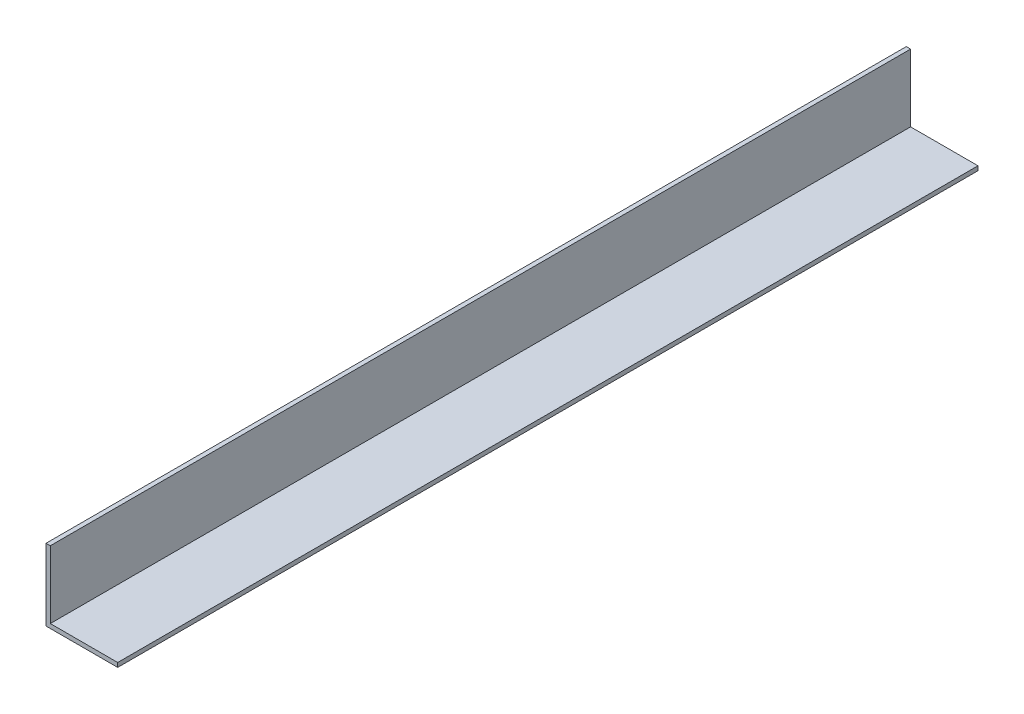
ISO-10303-21;
HEADER;
FILE_DESCRIPTION(('STEP AP214'),'2;1');
FILE_NAME('part.step','',(''),(''),'','','');
FILE_SCHEMA(('AUTOMOTIVE_DESIGN { 1 0 10303 214 1 1 1 1 }'));
ENDSEC;
DATA;
#1=APPLICATION_CONTEXT('core data for automotive mechanical design processes');
#2=APPLICATION_PROTOCOL_DEFINITION('international standard','automotive_design',2000,#1);
#3=PRODUCT_CONTEXT('',#1,'mechanical');
#4=PRODUCT('Part','Part','',(#3));
#5=PRODUCT_RELATED_PRODUCT_CATEGORY('part','',(#4));
#6=PRODUCT_DEFINITION_FORMATION('','',#4);
#7=PRODUCT_DEFINITION_CONTEXT('part definition',#1,'design');
#8=PRODUCT_DEFINITION('design','',#6,#7);
#9=PRODUCT_DEFINITION_SHAPE('','',#8);
#10=(LENGTH_UNIT() NAMED_UNIT(*) SI_UNIT(.MILLI.,.METRE.));
#11=(NAMED_UNIT(*) PLANE_ANGLE_UNIT() SI_UNIT($,.RADIAN.));
#12=(NAMED_UNIT(*) SI_UNIT($,.STERADIAN.) SOLID_ANGLE_UNIT());
#13=UNCERTAINTY_MEASURE_WITH_UNIT(LENGTH_MEASURE(1.E-05),#10,'distance_accuracy_value','');
#14=(GEOMETRIC_REPRESENTATION_CONTEXT(3) GLOBAL_UNCERTAINTY_ASSIGNED_CONTEXT((#13)) GLOBAL_UNIT_ASSIGNED_CONTEXT((#10,
#11,#12)) REPRESENTATION_CONTEXT('',''));
#15=CARTESIAN_POINT('',(0.,0.,0.));
#16=DIRECTION('',(0.,0.,1.));
#17=DIRECTION('',(1.,0.,0.));
#18=AXIS2_PLACEMENT_3D('',#15,#16,#17);
#19=CARTESIAN_POINT('',(25.,0.,300.));
#20=DIRECTION('',(0.,1.,0.));
#21=DIRECTION('',(-1.,0.,0.));
#22=AXIS2_PLACEMENT_3D('',#19,#20,#21);
#23=PLANE('',#22);
#24=DIRECTION('',(1.,0.,0.));
#25=VECTOR('',#24,1.);
#26=CARTESIAN_POINT('',(25.,0.,0.));
#27=LINE('',#26,#25);
#28=CARTESIAN_POINT('',(0.,0.,0.));
#29=VERTEX_POINT('',#28);
#30=CARTESIAN_POINT('',(25.,0.,0.));
#31=VERTEX_POINT('',#30);
#32=EDGE_CURVE('E116',#29,#31,#27,.T.);
#33=ORIENTED_EDGE('',*,*,#32,.T.);
#34=DIRECTION('',(0.,0.,-1.));
#35=VECTOR('',#34,1.);
#36=CARTESIAN_POINT('',(25.,0.,300.));
#37=LINE('',#36,#35);
#38=CARTESIAN_POINT('',(25.,0.,300.));
#39=VERTEX_POINT('',#38);
#40=EDGE_CURVE('E11',#39,#31,#37,.T.);
#41=ORIENTED_EDGE('',*,*,#40,.F.);
#42=DIRECTION('',(1.,0.,0.));
#43=VECTOR('',#42,1.);
#44=CARTESIAN_POINT('',(25.,0.,300.));
#45=LINE('',#44,#43);
#46=CARTESIAN_POINT('',(0.,0.,300.));
#47=VERTEX_POINT('',#46);
#48=EDGE_CURVE('E126',#47,#39,#45,.T.);
#49=ORIENTED_EDGE('',*,*,#48,.F.);
#50=DIRECTION('',(0.,0.,-1.));
#51=VECTOR('',#50,1.);
#52=CARTESIAN_POINT('',(0.,0.,300.));
#53=LINE('',#52,#51);
#54=EDGE_CURVE('E112',#47,#29,#53,.T.);
#55=ORIENTED_EDGE('',*,*,#54,.T.);
#56=EDGE_LOOP('',(#33,#41,#49,#55));
#57=FACE_BOUND('',#56,.T.);
#58=ADVANCED_FACE('F32',(#57),#23,.F.);
#59=CARTESIAN_POINT('',(25.,1.5,300.));
#60=DIRECTION('',(-1.,0.,0.));
#61=DIRECTION('',(0.,0.,1.));
#62=AXIS2_PLACEMENT_3D('',#59,#60,#61);
#63=PLANE('',#62);
#64=DIRECTION('',(0.,1.,0.));
#65=VECTOR('',#64,1.);
#66=CARTESIAN_POINT('',(25.,1.5,0.));
#67=LINE('',#66,#65);
#68=CARTESIAN_POINT('',(25.,1.5,0.));
#69=VERTEX_POINT('',#68);
#70=EDGE_CURVE('E119',#31,#69,#67,.T.);
#71=ORIENTED_EDGE('',*,*,#70,.T.);
#72=DIRECTION('',(0.,0.,-1.));
#73=VECTOR('',#72,1.);
#74=CARTESIAN_POINT('',(25.,1.5,300.));
#75=LINE('',#74,#73);
#76=CARTESIAN_POINT('',(25.,1.5,300.));
#77=VERTEX_POINT('',#76);
#78=EDGE_CURVE('E40',#77,#69,#75,.T.);
#79=ORIENTED_EDGE('',*,*,#78,.F.);
#80=DIRECTION('',(0.,1.,0.));
#81=VECTOR('',#80,1.);
#82=CARTESIAN_POINT('',(25.,1.5,300.));
#83=LINE('',#82,#81);
#84=EDGE_CURVE('E85',#39,#77,#83,.T.);
#85=ORIENTED_EDGE('',*,*,#84,.F.);
#86=ORIENTED_EDGE('',*,*,#40,.T.);
#87=EDGE_LOOP('',(#71,#79,#85,#86));
#88=FACE_BOUND('',#87,.T.);
#89=ADVANCED_FACE('F150',(#88),#63,.F.);
#90=CARTESIAN_POINT('',(1.5,1.5,300.));
#91=DIRECTION('',(0.,-1.,0.));
#92=DIRECTION('',(1.,0.,0.));
#93=AXIS2_PLACEMENT_3D('',#90,#91,#92);
#94=PLANE('',#93);
#95=DIRECTION('',(-1.,0.,0.));
#96=VECTOR('',#95,1.);
#97=CARTESIAN_POINT('',(1.5,1.5,0.));
#98=LINE('',#97,#96);
#99=CARTESIAN_POINT('',(1.5,1.5,0.));
#100=VERTEX_POINT('',#99);
#101=EDGE_CURVE('E121',#69,#100,#98,.T.);
#102=ORIENTED_EDGE('',*,*,#101,.T.);
#103=DIRECTION('',(0.,0.,-1.));
#104=VECTOR('',#103,1.);
#105=CARTESIAN_POINT('',(1.5,1.5,300.));
#106=LINE('',#105,#104);
#107=CARTESIAN_POINT('',(1.5,1.5,300.));
#108=VERTEX_POINT('',#107);
#109=EDGE_CURVE('E107',#108,#100,#106,.T.);
#110=ORIENTED_EDGE('',*,*,#109,.F.);
#111=DIRECTION('',(-1.,0.,0.));
#112=VECTOR('',#111,1.);
#113=CARTESIAN_POINT('',(1.5,1.5,300.));
#114=LINE('',#113,#112);
#115=EDGE_CURVE('E98',#77,#108,#114,.T.);
#116=ORIENTED_EDGE('',*,*,#115,.F.);
#117=ORIENTED_EDGE('',*,*,#78,.T.);
#118=EDGE_LOOP('',(#102,#110,#116,#117));
#119=FACE_BOUND('',#118,.T.);
#120=ADVANCED_FACE('F132',(#119),#94,.F.);
#121=CARTESIAN_POINT('',(1.5,25.,300.));
#122=DIRECTION('',(-1.,0.,0.));
#123=DIRECTION('',(0.,-1.,0.));
#124=AXIS2_PLACEMENT_3D('',#121,#122,#123);
#125=PLANE('',#124);
#126=DIRECTION('',(0.,1.,0.));
#127=VECTOR('',#126,1.);
#128=CARTESIAN_POINT('',(1.5,25.,0.));
#129=LINE('',#128,#127);
#130=CARTESIAN_POINT('',(1.5,25.,0.));
#131=VERTEX_POINT('',#130);
#132=EDGE_CURVE('E106',#100,#131,#129,.T.);
#133=ORIENTED_EDGE('',*,*,#132,.T.);
#134=DIRECTION('',(0.,0.,-1.));
#135=VECTOR('',#134,1.);
#136=CARTESIAN_POINT('',(1.5,25.,300.));
#137=LINE('',#136,#135);
#138=CARTESIAN_POINT('',(1.5,25.,300.));
#139=VERTEX_POINT('',#138);
#140=EDGE_CURVE('E103',#139,#131,#137,.T.);
#141=ORIENTED_EDGE('',*,*,#140,.F.);
#142=DIRECTION('',(0.,1.,0.));
#143=VECTOR('',#142,1.);
#144=CARTESIAN_POINT('',(1.5,25.,300.));
#145=LINE('',#144,#143);
#146=EDGE_CURVE('E92',#108,#139,#145,.T.);
#147=ORIENTED_EDGE('',*,*,#146,.F.);
#148=ORIENTED_EDGE('',*,*,#109,.T.);
#149=EDGE_LOOP('',(#133,#141,#147,#148));
#150=FACE_BOUND('',#149,.T.);
#151=ADVANCED_FACE('F104',(#150),#125,.F.);
#152=CARTESIAN_POINT('',(0.,25.,300.));
#153=DIRECTION('',(0.,-1.,0.));
#154=DIRECTION('',(0.,0.,-1.));
#155=AXIS2_PLACEMENT_3D('',#152,#153,#154);
#156=PLANE('',#155);
#157=DIRECTION('',(-1.,0.,0.));
#158=VECTOR('',#157,1.);
#159=CARTESIAN_POINT('',(0.,25.,0.));
#160=LINE('',#159,#158);
#161=CARTESIAN_POINT('',(0.,25.,0.));
#162=VERTEX_POINT('',#161);
#163=EDGE_CURVE('E71',#131,#162,#160,.T.);
#164=ORIENTED_EDGE('',*,*,#163,.T.);
#165=DIRECTION('',(0.,0.,-1.));
#166=VECTOR('',#165,1.);
#167=CARTESIAN_POINT('',(0.,25.,300.));
#168=LINE('',#167,#166);
#169=CARTESIAN_POINT('',(0.,25.,300.));
#170=VERTEX_POINT('',#169);
#171=EDGE_CURVE('E108',#170,#162,#168,.T.);
#172=ORIENTED_EDGE('',*,*,#171,.F.);
#173=DIRECTION('',(-1.,0.,0.));
#174=VECTOR('',#173,1.);
#175=CARTESIAN_POINT('',(0.,25.,300.));
#176=LINE('',#175,#174);
#177=EDGE_CURVE('E96',#139,#170,#176,.T.);
#178=ORIENTED_EDGE('',*,*,#177,.F.);
#179=ORIENTED_EDGE('',*,*,#140,.T.);
#180=EDGE_LOOP('',(#164,#172,#178,#179));
#181=FACE_BOUND('',#180,.T.);
#182=ADVANCED_FACE('F110',(#181),#156,.F.);
#183=CARTESIAN_POINT('',(0.,0.,300.));
#184=DIRECTION('',(1.,0.,0.));
#185=DIRECTION('',(0.,0.,-1.));
#186=AXIS2_PLACEMENT_3D('',#183,#184,#185);
#187=PLANE('',#186);
#188=DIRECTION('',(0.,-1.,0.));
#189=VECTOR('',#188,1.);
#190=CARTESIAN_POINT('',(0.,0.,0.));
#191=LINE('',#190,#189);
#192=EDGE_CURVE('E77',#162,#29,#191,.T.);
#193=ORIENTED_EDGE('',*,*,#192,.T.);
#194=ORIENTED_EDGE('',*,*,#54,.F.);
#195=DIRECTION('',(0.,-1.,0.));
#196=VECTOR('',#195,1.);
#197=CARTESIAN_POINT('',(0.,0.,300.));
#198=LINE('',#197,#196);
#199=EDGE_CURVE('E48',#170,#47,#198,.T.);
#200=ORIENTED_EDGE('',*,*,#199,.F.);
#201=ORIENTED_EDGE('',*,*,#171,.T.);
#202=EDGE_LOOP('',(#193,#194,#200,#201));
#203=FACE_BOUND('',#202,.T.);
#204=ADVANCED_FACE('F139',(#203),#187,.F.);
#205=CARTESIAN_POINT('',(0.,0.,300.));
#206=DIRECTION('',(0.,0.,-1.));
#207=DIRECTION('',(-1.,0.,0.));
#208=AXIS2_PLACEMENT_3D('',#205,#206,#207);
#209=PLANE('',#208);
#210=ORIENTED_EDGE('',*,*,#48,.T.);
#211=ORIENTED_EDGE('',*,*,#84,.T.);
#212=ORIENTED_EDGE('',*,*,#115,.T.);
#213=ORIENTED_EDGE('',*,*,#146,.T.);
#214=ORIENTED_EDGE('',*,*,#177,.T.);
#215=ORIENTED_EDGE('',*,*,#199,.T.);
#216=EDGE_LOOP('',(#210,#211,#212,#213,#214,#215));
#217=FACE_BOUND('',#216,.T.);
#218=ADVANCED_FACE('F94',(#217),#209,.F.);
#219=CARTESIAN_POINT('',(0.,0.,0.));
#220=DIRECTION('',(0.,0.,-1.));
#221=DIRECTION('',(-1.,0.,0.));
#222=AXIS2_PLACEMENT_3D('',#219,#220,#221);
#223=PLANE('',#222);
#224=ORIENTED_EDGE('',*,*,#32,.F.);
#225=ORIENTED_EDGE('',*,*,#192,.F.);
#226=ORIENTED_EDGE('',*,*,#163,.F.);
#227=ORIENTED_EDGE('',*,*,#132,.F.);
#228=ORIENTED_EDGE('',*,*,#101,.F.);
#229=ORIENTED_EDGE('',*,*,#70,.F.);
#230=EDGE_LOOP('',(#224,#225,#226,#227,#228,#229));
#231=FACE_BOUND('',#230,.T.);
#232=ADVANCED_FACE('F135',(#231),#223,.T.);
#233=CLOSED_SHELL('',(#58,#89,#120,#151,#182,#204,#218,#232));
#234=MANIFOLD_SOLID_BREP('B2',#233);
#235=ADVANCED_BREP_SHAPE_REPRESENTATION('',(#18,#234),#14);
#236=SHAPE_DEFINITION_REPRESENTATION(#9,#235);
ENDSEC;
END-ISO-10303-21;
